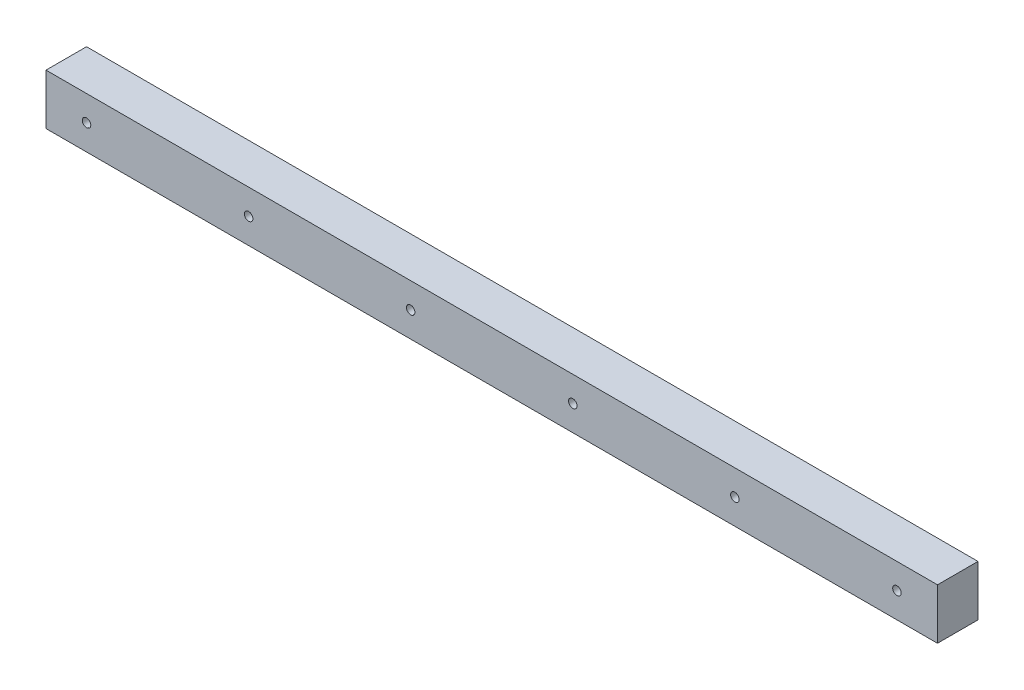
ISO-10303-21;
HEADER;
FILE_DESCRIPTION(('STEP AP214'),'2;1');
FILE_NAME('part.step','',(''),(''),'','','');
FILE_SCHEMA(('AUTOMOTIVE_DESIGN { 1 0 10303 214 1 1 1 1 }'));
ENDSEC;
DATA;
#1=APPLICATION_CONTEXT('core data for automotive mechanical design processes');
#2=APPLICATION_PROTOCOL_DEFINITION('international standard','automotive_design',2000,#1);
#3=PRODUCT_CONTEXT('',#1,'mechanical');
#4=PRODUCT('Part','Part','',(#3));
#5=PRODUCT_RELATED_PRODUCT_CATEGORY('part','',(#4));
#6=PRODUCT_DEFINITION_FORMATION('','',#4);
#7=PRODUCT_DEFINITION_CONTEXT('part definition',#1,'design');
#8=PRODUCT_DEFINITION('design','',#6,#7);
#9=PRODUCT_DEFINITION_SHAPE('','',#8);
#10=(LENGTH_UNIT() NAMED_UNIT(*) SI_UNIT(.MILLI.,.METRE.));
#11=(NAMED_UNIT(*) PLANE_ANGLE_UNIT() SI_UNIT($,.RADIAN.));
#12=(NAMED_UNIT(*) SI_UNIT($,.STERADIAN.) SOLID_ANGLE_UNIT());
#13=UNCERTAINTY_MEASURE_WITH_UNIT(LENGTH_MEASURE(1.E-05),#10,'distance_accuracy_value','');
#14=(GEOMETRIC_REPRESENTATION_CONTEXT(3) GLOBAL_UNCERTAINTY_ASSIGNED_CONTEXT((#13)) GLOBAL_UNIT_ASSIGNED_CONTEXT((#10,
#11,#12)) REPRESENTATION_CONTEXT('',''));
#15=CARTESIAN_POINT('',(0.,0.,0.));
#16=DIRECTION('',(0.,0.,1.));
#17=DIRECTION('',(1.,0.,0.));
#18=AXIS2_PLACEMENT_3D('',#15,#16,#17);
#19=CARTESIAN_POINT('',(220.,25.,-10.));
#20=DIRECTION('',(-1.,0.,0.));
#21=DIRECTION('',(0.,0.,1.));
#22=AXIS2_PLACEMENT_3D('',#19,#20,#21);
#23=PLANE('',#22);
#24=DIRECTION('',(0.,0.,-1.));
#25=VECTOR('',#24,1.);
#26=CARTESIAN_POINT('',(220.,0.,-10.));
#27=LINE('',#26,#25);
#28=CARTESIAN_POINT('',(220.,0.,10.));
#29=VERTEX_POINT('',#28);
#30=CARTESIAN_POINT('',(220.,0.,-10.));
#31=VERTEX_POINT('',#30);
#32=EDGE_CURVE('E215',#29,#31,#27,.T.);
#33=ORIENTED_EDGE('',*,*,#32,.T.);
#34=DIRECTION('',(0.,-1.,0.));
#35=VECTOR('',#34,1.);
#36=CARTESIAN_POINT('',(220.,25.,-10.));
#37=LINE('',#36,#35);
#38=CARTESIAN_POINT('',(220.,25.,-10.));
#39=VERTEX_POINT('',#38);
#40=EDGE_CURVE('E11',#39,#31,#37,.T.);
#41=ORIENTED_EDGE('',*,*,#40,.F.);
#42=DIRECTION('',(0.,0.,-1.));
#43=VECTOR('',#42,1.);
#44=CARTESIAN_POINT('',(220.,25.,-10.));
#45=LINE('',#44,#43);
#46=CARTESIAN_POINT('',(220.,25.,10.));
#47=VERTEX_POINT('',#46);
#48=EDGE_CURVE('E216',#47,#39,#45,.T.);
#49=ORIENTED_EDGE('',*,*,#48,.F.);
#50=DIRECTION('',(0.,-1.,0.));
#51=VECTOR('',#50,1.);
#52=CARTESIAN_POINT('',(220.,25.,10.));
#53=LINE('',#52,#51);
#54=EDGE_CURVE('E226',#47,#29,#53,.T.);
#55=ORIENTED_EDGE('',*,*,#54,.T.);
#56=EDGE_LOOP('',(#33,#41,#49,#55));
#57=FACE_BOUND('',#56,.T.);
#58=ADVANCED_FACE('F42',(#57),#23,.F.);
#59=CARTESIAN_POINT('',(-220.,25.,-10.));
#60=DIRECTION('',(0.,0.,1.));
#61=DIRECTION('',(1.,0.,0.));
#62=AXIS2_PLACEMENT_3D('',#59,#60,#61);
#63=PLANE('',#62);
#64=CARTESIAN_POINT('',(0.,12.5,-10.));
#65=DIRECTION('',(0.,0.,-1.));
#66=DIRECTION('',(-1.,0.,0.));
#67=AXIS2_PLACEMENT_3D('',#64,#65,#66);
#68=CIRCLE('',#67,2.09999999999999);
#69=CARTESIAN_POINT('',(-2.09999999999999,12.5,-10.));
#70=VERTEX_POINT('',#69);
#71=EDGE_CURVE('E167',#70,#70,#68,.T.);
#72=ORIENTED_EDGE('',*,*,#71,.F.);
#73=EDGE_LOOP('',(#72));
#74=FACE_BOUND('',#73,.T.);
#75=CARTESIAN_POINT('',(-60.,12.5,-10.));
#76=DIRECTION('',(0.,0.,-1.));
#77=DIRECTION('',(-1.,0.,0.));
#78=AXIS2_PLACEMENT_3D('',#75,#76,#77);
#79=CIRCLE('',#78,2.09999999999999);
#80=CARTESIAN_POINT('',(-62.1,12.5,-10.));
#81=VERTEX_POINT('',#80);
#82=EDGE_CURVE('E175',#81,#81,#79,.T.);
#83=ORIENTED_EDGE('',*,*,#82,.F.);
#84=EDGE_LOOP('',(#83));
#85=FACE_BOUND('',#84,.T.);
#86=CARTESIAN_POINT('',(-120.,12.5,-10.));
#87=DIRECTION('',(0.,0.,-1.));
#88=DIRECTION('',(-1.,0.,0.));
#89=AXIS2_PLACEMENT_3D('',#86,#87,#88);
#90=CIRCLE('',#89,2.09999999999999);
#91=CARTESIAN_POINT('',(-122.1,12.5,-10.));
#92=VERTEX_POINT('',#91);
#93=EDGE_CURVE('E183',#92,#92,#90,.T.);
#94=ORIENTED_EDGE('',*,*,#93,.F.);
#95=EDGE_LOOP('',(#94));
#96=FACE_BOUND('',#95,.T.);
#97=CARTESIAN_POINT('',(-180.,12.5,-10.));
#98=DIRECTION('',(0.,0.,-1.));
#99=DIRECTION('',(-1.,0.,0.));
#100=AXIS2_PLACEMENT_3D('',#97,#98,#99);
#101=CIRCLE('',#100,2.09999999999999);
#102=CARTESIAN_POINT('',(-182.1,12.5,-10.));
#103=VERTEX_POINT('',#102);
#104=EDGE_CURVE('E187',#103,#103,#101,.T.);
#105=ORIENTED_EDGE('',*,*,#104,.F.);
#106=EDGE_LOOP('',(#105));
#107=FACE_BOUND('',#106,.T.);
#108=CARTESIAN_POINT('',(60.,12.4999999999996,-10.));
#109=DIRECTION('',(0.,0.,-1.));
#110=DIRECTION('',(-1.,0.,0.));
#111=AXIS2_PLACEMENT_3D('',#108,#109,#110);
#112=CIRCLE('',#111,2.09999999999999);
#113=CARTESIAN_POINT('',(57.9,12.4999999999996,-10.));
#114=VERTEX_POINT('',#113);
#115=EDGE_CURVE('E195',#114,#114,#112,.T.);
#116=ORIENTED_EDGE('',*,*,#115,.F.);
#117=EDGE_LOOP('',(#116));
#118=FACE_BOUND('',#117,.T.);
#119=CARTESIAN_POINT('',(120.,12.4999999999992,-10.));
#120=DIRECTION('',(0.,0.,-1.));
#121=DIRECTION('',(-1.,0.,0.));
#122=AXIS2_PLACEMENT_3D('',#119,#120,#121);
#123=CIRCLE('',#122,2.09999999999999);
#124=CARTESIAN_POINT('',(117.9,12.4999999999992,-10.));
#125=VERTEX_POINT('',#124);
#126=EDGE_CURVE('E203',#125,#125,#123,.T.);
#127=ORIENTED_EDGE('',*,*,#126,.F.);
#128=EDGE_LOOP('',(#127));
#129=FACE_BOUND('',#128,.T.);
#130=CARTESIAN_POINT('',(180.,12.4999999999987,-10.));
#131=DIRECTION('',(0.,0.,-1.));
#132=DIRECTION('',(-1.,0.,0.));
#133=AXIS2_PLACEMENT_3D('',#130,#131,#132);
#134=CIRCLE('',#133,2.09999999999999);
#135=CARTESIAN_POINT('',(177.9,12.4999999999987,-10.));
#136=VERTEX_POINT('',#135);
#137=EDGE_CURVE('E207',#136,#136,#134,.T.);
#138=ORIENTED_EDGE('',*,*,#137,.F.);
#139=EDGE_LOOP('',(#138));
#140=FACE_BOUND('',#139,.T.);
#141=DIRECTION('',(-1.,0.,0.));
#142=VECTOR('',#141,1.);
#143=CARTESIAN_POINT('',(-220.,0.,-10.));
#144=LINE('',#143,#142);
#145=CARTESIAN_POINT('',(-220.,0.,-10.));
#146=VERTEX_POINT('',#145);
#147=EDGE_CURVE('E230',#31,#146,#144,.T.);
#148=ORIENTED_EDGE('',*,*,#147,.T.);
#149=DIRECTION('',(0.,-1.,0.));
#150=VECTOR('',#149,1.);
#151=CARTESIAN_POINT('',(-220.,25.,-10.));
#152=LINE('',#151,#150);
#153=CARTESIAN_POINT('',(-220.,25.,-10.));
#154=VERTEX_POINT('',#153);
#155=EDGE_CURVE('E51',#154,#146,#152,.T.);
#156=ORIENTED_EDGE('',*,*,#155,.F.);
#157=DIRECTION('',(-1.,0.,0.));
#158=VECTOR('',#157,1.);
#159=CARTESIAN_POINT('',(-220.,25.,-10.));
#160=LINE('',#159,#158);
#161=EDGE_CURVE('E90',#39,#154,#160,.T.);
#162=ORIENTED_EDGE('',*,*,#161,.F.);
#163=ORIENTED_EDGE('',*,*,#40,.T.);
#164=EDGE_LOOP('',(#148,#156,#162,#163));
#165=FACE_BOUND('',#164,.T.);
#166=ADVANCED_FACE('F261',(#74,#85,#96,#107,#118,#129,#140,#165),#63,.F.);
#167=CARTESIAN_POINT('',(-220.,25.,-10.));
#168=DIRECTION('',(1.,0.,0.));
#169=DIRECTION('',(0.,0.,-1.));
#170=AXIS2_PLACEMENT_3D('',#167,#168,#169);
#171=PLANE('',#170);
#172=DIRECTION('',(0.,0.,1.));
#173=VECTOR('',#172,1.);
#174=CARTESIAN_POINT('',(-220.,0.,-10.));
#175=LINE('',#174,#173);
#176=CARTESIAN_POINT('',(-220.,0.,10.));
#177=VERTEX_POINT('',#176);
#178=EDGE_CURVE('E77',#146,#177,#175,.T.);
#179=ORIENTED_EDGE('',*,*,#178,.T.);
#180=DIRECTION('',(0.,-1.,0.));
#181=VECTOR('',#180,1.);
#182=CARTESIAN_POINT('',(-220.,25.,10.));
#183=LINE('',#182,#181);
#184=CARTESIAN_POINT('',(-220.,25.,10.));
#185=VERTEX_POINT('',#184);
#186=EDGE_CURVE('E239',#185,#177,#183,.T.);
#187=ORIENTED_EDGE('',*,*,#186,.F.);
#188=DIRECTION('',(0.,0.,1.));
#189=VECTOR('',#188,1.);
#190=CARTESIAN_POINT('',(-220.,25.,-10.));
#191=LINE('',#190,#189);
#192=EDGE_CURVE('E221',#154,#185,#191,.T.);
#193=ORIENTED_EDGE('',*,*,#192,.F.);
#194=ORIENTED_EDGE('',*,*,#155,.T.);
#195=EDGE_LOOP('',(#179,#187,#193,#194));
#196=FACE_BOUND('',#195,.T.);
#197=ADVANCED_FACE('F243',(#196),#171,.F.);
#198=CARTESIAN_POINT('',(-220.,25.,10.));
#199=DIRECTION('',(0.,0.,-1.));
#200=DIRECTION('',(-1.,0.,0.));
#201=AXIS2_PLACEMENT_3D('',#198,#199,#200);
#202=PLANE('',#201);
#203=CARTESIAN_POINT('',(40.,12.5,10.));
#204=DIRECTION('',(0.,0.,1.));
#205=DIRECTION('',(1.,0.,0.));
#206=AXIS2_PLACEMENT_3D('',#203,#204,#205);
#207=CIRCLE('',#206,2.09999999999999);
#208=CARTESIAN_POINT('',(42.1,12.5,10.));
#209=VERTEX_POINT('',#208);
#210=EDGE_CURVE('E130',#209,#209,#207,.T.);
#211=ORIENTED_EDGE('',*,*,#210,.F.);
#212=EDGE_LOOP('',(#211));
#213=FACE_BOUND('',#212,.T.);
#214=CARTESIAN_POINT('',(120.,12.5,10.));
#215=DIRECTION('',(0.,0.,1.));
#216=DIRECTION('',(1.,0.,0.));
#217=AXIS2_PLACEMENT_3D('',#214,#215,#216);
#218=CIRCLE('',#217,2.09999999999999);
#219=CARTESIAN_POINT('',(122.1,12.5,10.));
#220=VERTEX_POINT('',#219);
#221=EDGE_CURVE('E129',#220,#220,#218,.T.);
#222=ORIENTED_EDGE('',*,*,#221,.F.);
#223=EDGE_LOOP('',(#222));
#224=FACE_BOUND('',#223,.T.);
#225=CARTESIAN_POINT('',(200.,12.5,10.));
#226=DIRECTION('',(0.,0.,1.));
#227=DIRECTION('',(1.,0.,0.));
#228=AXIS2_PLACEMENT_3D('',#225,#226,#227);
#229=CIRCLE('',#228,2.09999999999999);
#230=CARTESIAN_POINT('',(202.1,12.5,10.));
#231=VERTEX_POINT('',#230);
#232=EDGE_CURVE('E135',#231,#231,#229,.T.);
#233=ORIENTED_EDGE('',*,*,#232,.F.);
#234=EDGE_LOOP('',(#233));
#235=FACE_BOUND('',#234,.T.);
#236=CARTESIAN_POINT('',(-40.,12.4999999999994,10.));
#237=DIRECTION('',(0.,0.,1.));
#238=DIRECTION('',(1.,0.,0.));
#239=AXIS2_PLACEMENT_3D('',#236,#237,#238);
#240=CIRCLE('',#239,2.09999999999999);
#241=CARTESIAN_POINT('',(-37.9,12.4999999999994,10.));
#242=VERTEX_POINT('',#241);
#243=EDGE_CURVE('E147',#242,#242,#240,.T.);
#244=ORIENTED_EDGE('',*,*,#243,.F.);
#245=EDGE_LOOP('',(#244));
#246=FACE_BOUND('',#245,.T.);
#247=CARTESIAN_POINT('',(-120.,12.4999999999989,10.));
#248=DIRECTION('',(0.,0.,1.));
#249=DIRECTION('',(1.,0.,0.));
#250=AXIS2_PLACEMENT_3D('',#247,#248,#249);
#251=CIRCLE('',#250,2.09999999999999);
#252=CARTESIAN_POINT('',(-117.9,12.4999999999989,10.));
#253=VERTEX_POINT('',#252);
#254=EDGE_CURVE('E155',#253,#253,#251,.T.);
#255=ORIENTED_EDGE('',*,*,#254,.F.);
#256=EDGE_LOOP('',(#255));
#257=FACE_BOUND('',#256,.T.);
#258=CARTESIAN_POINT('',(-200.,12.4999999999983,10.));
#259=DIRECTION('',(0.,0.,1.));
#260=DIRECTION('',(1.,0.,0.));
#261=AXIS2_PLACEMENT_3D('',#258,#259,#260);
#262=CIRCLE('',#261,2.09999999999999);
#263=CARTESIAN_POINT('',(-197.9,12.4999999999983,10.));
#264=VERTEX_POINT('',#263);
#265=EDGE_CURVE('E159',#264,#264,#262,.T.);
#266=ORIENTED_EDGE('',*,*,#265,.F.);
#267=EDGE_LOOP('',(#266));
#268=FACE_BOUND('',#267,.T.);
#269=DIRECTION('',(1.,0.,0.));
#270=VECTOR('',#269,1.);
#271=CARTESIAN_POINT('',(-220.,0.,10.));
#272=LINE('',#271,#270);
#273=EDGE_CURVE('E83',#177,#29,#272,.T.);
#274=ORIENTED_EDGE('',*,*,#273,.T.);
#275=ORIENTED_EDGE('',*,*,#54,.F.);
#276=DIRECTION('',(1.,0.,0.));
#277=VECTOR('',#276,1.);
#278=CARTESIAN_POINT('',(-220.,25.,10.));
#279=LINE('',#278,#277);
#280=EDGE_CURVE('E59',#185,#47,#279,.T.);
#281=ORIENTED_EDGE('',*,*,#280,.F.);
#282=ORIENTED_EDGE('',*,*,#186,.T.);
#283=EDGE_LOOP('',(#274,#275,#281,#282));
#284=FACE_BOUND('',#283,.T.);
#285=ADVANCED_FACE('F250',(#213,#224,#235,#246,#257,#268,#284),#202,.F.);
#286=CARTESIAN_POINT('',(0.,25.,0.));
#287=DIRECTION('',(0.,1.,0.));
#288=DIRECTION('',(0.,0.,1.));
#289=AXIS2_PLACEMENT_3D('',#286,#287,#288);
#290=PLANE('',#289);
#291=ORIENTED_EDGE('',*,*,#48,.T.);
#292=ORIENTED_EDGE('',*,*,#161,.T.);
#293=ORIENTED_EDGE('',*,*,#192,.T.);
#294=ORIENTED_EDGE('',*,*,#280,.T.);
#295=EDGE_LOOP('',(#291,#292,#293,#294));
#296=FACE_BOUND('',#295,.T.);
#297=ADVANCED_FACE('F252',(#296),#290,.T.);
#298=CARTESIAN_POINT('',(0.,0.,0.));
#299=DIRECTION('',(0.,1.,0.));
#300=DIRECTION('',(0.,0.,1.));
#301=AXIS2_PLACEMENT_3D('',#298,#299,#300);
#302=PLANE('',#301);
#303=ORIENTED_EDGE('',*,*,#32,.F.);
#304=ORIENTED_EDGE('',*,*,#273,.F.);
#305=ORIENTED_EDGE('',*,*,#178,.F.);
#306=ORIENTED_EDGE('',*,*,#147,.F.);
#307=EDGE_LOOP('',(#303,#304,#305,#306));
#308=FACE_BOUND('',#307,.T.);
#309=ADVANCED_FACE('F246',(#308),#302,.F.);
#310=CARTESIAN_POINT('',(180.,12.4999999999987,5.));
#311=DIRECTION('',(0.,0.,-1.));
#312=DIRECTION('',(-1.,0.,0.));
#313=AXIS2_PLACEMENT_3D('',#310,#311,#312);
#314=CONICAL_SURFACE('',#313,2.09999999999999,1.02974425867665);
#315=CARTESIAN_POINT('',(180.,12.4999999999987,6.26180729995787));
#316=VERTEX_POINT('',#315);
#317=VERTEX_LOOP('',#316);
#318=FACE_BOUND('',#317,.T.);
#319=CARTESIAN_POINT('',(180.,12.4999999999987,5.));
#320=DIRECTION('',(0.,0.,-1.));
#321=DIRECTION('',(-1.,0.,0.));
#322=AXIS2_PLACEMENT_3D('',#319,#320,#321);
#323=CIRCLE('',#322,2.09999999999999);
#324=CARTESIAN_POINT('',(177.9,12.4999999999987,5.));
#325=VERTEX_POINT('',#324);
#326=EDGE_CURVE('E211',#325,#325,#323,.T.);
#327=ORIENTED_EDGE('',*,*,#326,.T.);
#328=EDGE_LOOP('',(#327));
#329=FACE_BOUND('',#328,.T.);
#330=ADVANCED_FACE('F290',(#318,#329),#314,.F.);
#331=CARTESIAN_POINT('',(180.,12.4999999999987,-10.));
#332=DIRECTION('',(0.,0.,-1.));
#333=DIRECTION('',(-1.,0.,0.));
#334=AXIS2_PLACEMENT_3D('',#331,#332,#333);
#335=CYLINDRICAL_SURFACE('',#334,2.09999999999999);
#336=ORIENTED_EDGE('',*,*,#326,.F.);
#337=EDGE_LOOP('',(#336));
#338=FACE_BOUND('',#337,.T.);
#339=ORIENTED_EDGE('',*,*,#137,.T.);
#340=EDGE_LOOP('',(#339));
#341=FACE_BOUND('',#340,.T.);
#342=ADVANCED_FACE('F287',(#338,#341),#335,.F.);
#343=CARTESIAN_POINT('',(120.,12.4999999999992,-10.));
#344=DIRECTION('',(0.,0.,-1.));
#345=DIRECTION('',(-1.,0.,0.));
#346=AXIS2_PLACEMENT_3D('',#343,#344,#345);
#347=CYLINDRICAL_SURFACE('',#346,2.09999999999999);
#348=ORIENTED_EDGE('',*,*,#126,.T.);
#349=EDGE_LOOP('',(#348));
#350=FACE_BOUND('',#349,.T.);
#351=ORIENTED_EDGE('',*,*,#221,.T.);
#352=EDGE_LOOP('',(#351));
#353=FACE_BOUND('',#352,.T.);
#354=ADVANCED_FACE('F289',(#350,#353),#347,.F.);
#355=CARTESIAN_POINT('',(60.,12.4999999999996,5.));
#356=DIRECTION('',(0.,0.,-1.));
#357=DIRECTION('',(-1.,0.,0.));
#358=AXIS2_PLACEMENT_3D('',#355,#356,#357);
#359=CONICAL_SURFACE('',#358,2.1,1.02974425867665);
#360=CARTESIAN_POINT('',(60.,12.4999999999996,6.26180729995787));
#361=VERTEX_POINT('',#360);
#362=VERTEX_LOOP('',#361);
#363=FACE_BOUND('',#362,.T.);
#364=CARTESIAN_POINT('',(60.,12.4999999999996,5.));
#365=DIRECTION('',(0.,0.,-1.));
#366=DIRECTION('',(-1.,0.,0.));
#367=AXIS2_PLACEMENT_3D('',#364,#365,#366);
#368=CIRCLE('',#367,2.1);
#369=CARTESIAN_POINT('',(57.9,12.4999999999996,5.));
#370=VERTEX_POINT('',#369);
#371=EDGE_CURVE('E199',#370,#370,#368,.T.);
#372=ORIENTED_EDGE('',*,*,#371,.T.);
#373=EDGE_LOOP('',(#372));
#374=FACE_BOUND('',#373,.T.);
#375=ADVANCED_FACE('F298',(#363,#374),#359,.F.);
#376=CARTESIAN_POINT('',(60.,12.4999999999996,-10.));
#377=DIRECTION('',(0.,0.,-1.));
#378=DIRECTION('',(-1.,0.,0.));
#379=AXIS2_PLACEMENT_3D('',#376,#377,#378);
#380=CYLINDRICAL_SURFACE('',#379,2.09999999999999);
#381=ORIENTED_EDGE('',*,*,#371,.F.);
#382=EDGE_LOOP('',(#381));
#383=FACE_BOUND('',#382,.T.);
#384=ORIENTED_EDGE('',*,*,#115,.T.);
#385=EDGE_LOOP('',(#384));
#386=FACE_BOUND('',#385,.T.);
#387=ADVANCED_FACE('F330',(#383,#386),#380,.F.);
#388=CARTESIAN_POINT('',(-180.,12.5,5.));
#389=DIRECTION('',(0.,0.,-1.));
#390=DIRECTION('',(-1.,0.,0.));
#391=AXIS2_PLACEMENT_3D('',#388,#389,#390);
#392=CONICAL_SURFACE('',#391,2.09999999999999,1.02974425867665);
#393=CARTESIAN_POINT('',(-180.,12.5,6.26180729995787));
#394=VERTEX_POINT('',#393);
#395=VERTEX_LOOP('',#394);
#396=FACE_BOUND('',#395,.T.);
#397=CARTESIAN_POINT('',(-180.,12.5,5.));
#398=DIRECTION('',(0.,0.,-1.));
#399=DIRECTION('',(-1.,0.,0.));
#400=AXIS2_PLACEMENT_3D('',#397,#398,#399);
#401=CIRCLE('',#400,2.09999999999999);
#402=CARTESIAN_POINT('',(-182.1,12.5,5.));
#403=VERTEX_POINT('',#402);
#404=EDGE_CURVE('E191',#403,#403,#401,.T.);
#405=ORIENTED_EDGE('',*,*,#404,.T.);
#406=EDGE_LOOP('',(#405));
#407=FACE_BOUND('',#406,.T.);
#408=ADVANCED_FACE('F337',(#396,#407),#392,.F.);
#409=CARTESIAN_POINT('',(-180.,12.5,-10.));
#410=DIRECTION('',(0.,0.,-1.));
#411=DIRECTION('',(-1.,0.,0.));
#412=AXIS2_PLACEMENT_3D('',#409,#410,#411);
#413=CYLINDRICAL_SURFACE('',#412,2.09999999999999);
#414=ORIENTED_EDGE('',*,*,#404,.F.);
#415=EDGE_LOOP('',(#414));
#416=FACE_BOUND('',#415,.T.);
#417=ORIENTED_EDGE('',*,*,#104,.T.);
#418=EDGE_LOOP('',(#417));
#419=FACE_BOUND('',#418,.T.);
#420=ADVANCED_FACE('F348',(#416,#419),#413,.F.);
#421=CARTESIAN_POINT('',(-120.,12.5,-10.));
#422=DIRECTION('',(0.,0.,-1.));
#423=DIRECTION('',(-1.,0.,0.));
#424=AXIS2_PLACEMENT_3D('',#421,#422,#423);
#425=CYLINDRICAL_SURFACE('',#424,2.09999999999999);
#426=ORIENTED_EDGE('',*,*,#93,.T.);
#427=EDGE_LOOP('',(#426));
#428=FACE_BOUND('',#427,.T.);
#429=ORIENTED_EDGE('',*,*,#254,.T.);
#430=EDGE_LOOP('',(#429));
#431=FACE_BOUND('',#430,.T.);
#432=ADVANCED_FACE('F356',(#428,#431),#425,.F.);
#433=CARTESIAN_POINT('',(-60.,12.5,5.));
#434=DIRECTION('',(0.,0.,-1.));
#435=DIRECTION('',(-1.,0.,0.));
#436=AXIS2_PLACEMENT_3D('',#433,#434,#435);
#437=CONICAL_SURFACE('',#436,2.1,1.02974425867665);
#438=CARTESIAN_POINT('',(-60.,12.5,6.26180729995787));
#439=VERTEX_POINT('',#438);
#440=VERTEX_LOOP('',#439);
#441=FACE_BOUND('',#440,.T.);
#442=CARTESIAN_POINT('',(-60.,12.5,5.));
#443=DIRECTION('',(0.,0.,-1.));
#444=DIRECTION('',(-1.,0.,0.));
#445=AXIS2_PLACEMENT_3D('',#442,#443,#444);
#446=CIRCLE('',#445,2.1);
#447=CARTESIAN_POINT('',(-62.1,12.5,5.));
#448=VERTEX_POINT('',#447);
#449=EDGE_CURVE('E179',#448,#448,#446,.T.);
#450=ORIENTED_EDGE('',*,*,#449,.T.);
#451=EDGE_LOOP('',(#450));
#452=FACE_BOUND('',#451,.T.);
#453=ADVANCED_FACE('F364',(#441,#452),#437,.F.);
#454=CARTESIAN_POINT('',(-60.,12.5,-10.));
#455=DIRECTION('',(0.,0.,-1.));
#456=DIRECTION('',(-1.,0.,0.));
#457=AXIS2_PLACEMENT_3D('',#454,#455,#456);
#458=CYLINDRICAL_SURFACE('',#457,2.09999999999999);
#459=ORIENTED_EDGE('',*,*,#449,.F.);
#460=EDGE_LOOP('',(#459));
#461=FACE_BOUND('',#460,.T.);
#462=ORIENTED_EDGE('',*,*,#82,.T.);
#463=EDGE_LOOP('',(#462));
#464=FACE_BOUND('',#463,.T.);
#465=ADVANCED_FACE('F368',(#461,#464),#458,.F.);
#466=CARTESIAN_POINT('',(0.,12.5,5.));
#467=DIRECTION('',(0.,0.,-1.));
#468=DIRECTION('',(-1.,0.,0.));
#469=AXIS2_PLACEMENT_3D('',#466,#467,#468);
#470=CONICAL_SURFACE('',#469,2.1,1.02974425867665);
#471=CARTESIAN_POINT('',(0.,12.5,6.26180729995787));
#472=VERTEX_POINT('',#471);
#473=VERTEX_LOOP('',#472);
#474=FACE_BOUND('',#473,.T.);
#475=CARTESIAN_POINT('',(0.,12.5,5.));
#476=DIRECTION('',(0.,0.,-1.));
#477=DIRECTION('',(-1.,0.,0.));
#478=AXIS2_PLACEMENT_3D('',#475,#476,#477);
#479=CIRCLE('',#478,2.1);
#480=CARTESIAN_POINT('',(-2.1,12.5,5.));
#481=VERTEX_POINT('',#480);
#482=EDGE_CURVE('E171',#481,#481,#479,.T.);
#483=ORIENTED_EDGE('',*,*,#482,.T.);
#484=EDGE_LOOP('',(#483));
#485=FACE_BOUND('',#484,.T.);
#486=ADVANCED_FACE('F376',(#474,#485),#470,.F.);
#487=CARTESIAN_POINT('',(0.,12.5,-10.));
#488=DIRECTION('',(0.,0.,-1.));
#489=DIRECTION('',(-1.,0.,0.));
#490=AXIS2_PLACEMENT_3D('',#487,#488,#489);
#491=CYLINDRICAL_SURFACE('',#490,2.09999999999999);
#492=ORIENTED_EDGE('',*,*,#482,.F.);
#493=EDGE_LOOP('',(#492));
#494=FACE_BOUND('',#493,.T.);
#495=ORIENTED_EDGE('',*,*,#71,.T.);
#496=EDGE_LOOP('',(#495));
#497=FACE_BOUND('',#496,.T.);
#498=ADVANCED_FACE('F387',(#494,#497),#491,.F.);
#499=CARTESIAN_POINT('',(-200.,12.4999999999983,-5.));
#500=DIRECTION('',(0.,0.,1.));
#501=DIRECTION('',(1.,0.,0.));
#502=AXIS2_PLACEMENT_3D('',#499,#500,#501);
#503=CONICAL_SURFACE('',#502,2.09999999999999,1.02974425867665);
#504=CARTESIAN_POINT('',(-200.,12.4999999999983,-6.26180729995787));
#505=VERTEX_POINT('',#504);
#506=VERTEX_LOOP('',#505);
#507=FACE_BOUND('',#506,.T.);
#508=CARTESIAN_POINT('',(-200.,12.4999999999983,-5.));
#509=DIRECTION('',(0.,0.,1.));
#510=DIRECTION('',(1.,0.,0.));
#511=AXIS2_PLACEMENT_3D('',#508,#509,#510);
#512=CIRCLE('',#511,2.09999999999999);
#513=CARTESIAN_POINT('',(-197.9,12.4999999999983,-5.));
#514=VERTEX_POINT('',#513);
#515=EDGE_CURVE('E163',#514,#514,#512,.T.);
#516=ORIENTED_EDGE('',*,*,#515,.T.);
#517=EDGE_LOOP('',(#516));
#518=FACE_BOUND('',#517,.T.);
#519=ADVANCED_FACE('F394',(#507,#518),#503,.F.);
#520=CARTESIAN_POINT('',(-200.,12.4999999999983,10.));
#521=DIRECTION('',(0.,0.,1.));
#522=DIRECTION('',(1.,0.,0.));
#523=AXIS2_PLACEMENT_3D('',#520,#521,#522);
#524=CYLINDRICAL_SURFACE('',#523,2.09999999999999);
#525=ORIENTED_EDGE('',*,*,#515,.F.);
#526=EDGE_LOOP('',(#525));
#527=FACE_BOUND('',#526,.T.);
#528=ORIENTED_EDGE('',*,*,#265,.T.);
#529=EDGE_LOOP('',(#528));
#530=FACE_BOUND('',#529,.T.);
#531=ADVANCED_FACE('F415',(#527,#530),#524,.F.);
#532=CARTESIAN_POINT('',(-40.,12.4999999999994,-5.));
#533=DIRECTION('',(0.,0.,1.));
#534=DIRECTION('',(1.,0.,0.));
#535=AXIS2_PLACEMENT_3D('',#532,#533,#534);
#536=CONICAL_SURFACE('',#535,2.1,1.02974425867665);
#537=CARTESIAN_POINT('',(-40.,12.4999999999994,-6.26180729995787));
#538=VERTEX_POINT('',#537);
#539=VERTEX_LOOP('',#538);
#540=FACE_BOUND('',#539,.T.);
#541=CARTESIAN_POINT('',(-40.,12.4999999999994,-5.));
#542=DIRECTION('',(0.,0.,1.));
#543=DIRECTION('',(1.,0.,0.));
#544=AXIS2_PLACEMENT_3D('',#541,#542,#543);
#545=CIRCLE('',#544,2.1);
#546=CARTESIAN_POINT('',(-37.9,12.4999999999994,-5.));
#547=VERTEX_POINT('',#546);
#548=EDGE_CURVE('E151',#547,#547,#545,.T.);
#549=ORIENTED_EDGE('',*,*,#548,.T.);
#550=EDGE_LOOP('',(#549));
#551=FACE_BOUND('',#550,.T.);
#552=ADVANCED_FACE('F424',(#540,#551),#536,.F.);
#553=CARTESIAN_POINT('',(-40.,12.4999999999994,10.));
#554=DIRECTION('',(0.,0.,1.));
#555=DIRECTION('',(1.,0.,0.));
#556=AXIS2_PLACEMENT_3D('',#553,#554,#555);
#557=CYLINDRICAL_SURFACE('',#556,2.09999999999999);
#558=ORIENTED_EDGE('',*,*,#548,.F.);
#559=EDGE_LOOP('',(#558));
#560=FACE_BOUND('',#559,.T.);
#561=ORIENTED_EDGE('',*,*,#243,.T.);
#562=EDGE_LOOP('',(#561));
#563=FACE_BOUND('',#562,.T.);
#564=ADVANCED_FACE('F433',(#560,#563),#557,.F.);
#565=CARTESIAN_POINT('',(200.,12.5,-5.));
#566=DIRECTION('',(0.,0.,1.));
#567=DIRECTION('',(1.,0.,0.));
#568=AXIS2_PLACEMENT_3D('',#565,#566,#567);
#569=CONICAL_SURFACE('',#568,2.09999999999999,1.02974425867665);
#570=CARTESIAN_POINT('',(200.,12.5,-6.26180729995787));
#571=VERTEX_POINT('',#570);
#572=VERTEX_LOOP('',#571);
#573=FACE_BOUND('',#572,.T.);
#574=CARTESIAN_POINT('',(200.,12.5,-5.));
#575=DIRECTION('',(0.,0.,1.));
#576=DIRECTION('',(1.,0.,0.));
#577=AXIS2_PLACEMENT_3D('',#574,#575,#576);
#578=CIRCLE('',#577,2.09999999999999);
#579=CARTESIAN_POINT('',(202.1,12.5,-5.));
#580=VERTEX_POINT('',#579);
#581=EDGE_CURVE('E143',#580,#580,#578,.T.);
#582=ORIENTED_EDGE('',*,*,#581,.T.);
#583=EDGE_LOOP('',(#582));
#584=FACE_BOUND('',#583,.T.);
#585=ADVANCED_FACE('F441',(#573,#584),#569,.F.);
#586=CARTESIAN_POINT('',(200.,12.5,10.));
#587=DIRECTION('',(0.,0.,1.));
#588=DIRECTION('',(1.,0.,0.));
#589=AXIS2_PLACEMENT_3D('',#586,#587,#588);
#590=CYLINDRICAL_SURFACE('',#589,2.09999999999999);
#591=ORIENTED_EDGE('',*,*,#581,.F.);
#592=EDGE_LOOP('',(#591));
#593=FACE_BOUND('',#592,.T.);
#594=ORIENTED_EDGE('',*,*,#232,.T.);
#595=EDGE_LOOP('',(#594));
#596=FACE_BOUND('',#595,.T.);
#597=ADVANCED_FACE('F122',(#593,#596),#590,.F.);
#598=CARTESIAN_POINT('',(40.,12.5,-5.));
#599=DIRECTION('',(0.,0.,1.));
#600=DIRECTION('',(1.,0.,0.));
#601=AXIS2_PLACEMENT_3D('',#598,#599,#600);
#602=CONICAL_SURFACE('',#601,2.1,1.02974425867665);
#603=CARTESIAN_POINT('',(40.,12.5,-6.26180729995787));
#604=VERTEX_POINT('',#603);
#605=VERTEX_LOOP('',#604);
#606=FACE_BOUND('',#605,.T.);
#607=CARTESIAN_POINT('',(40.,12.5,-5.));
#608=DIRECTION('',(0.,0.,1.));
#609=DIRECTION('',(1.,0.,0.));
#610=AXIS2_PLACEMENT_3D('',#607,#608,#609);
#611=CIRCLE('',#610,2.1);
#612=CARTESIAN_POINT('',(42.1,12.5,-5.));
#613=VERTEX_POINT('',#612);
#614=EDGE_CURVE('E126',#613,#613,#611,.T.);
#615=ORIENTED_EDGE('',*,*,#614,.T.);
#616=EDGE_LOOP('',(#615));
#617=FACE_BOUND('',#616,.T.);
#618=ADVANCED_FACE('F118',(#606,#617),#602,.F.);
#619=CARTESIAN_POINT('',(40.,12.5,10.));
#620=DIRECTION('',(0.,0.,1.));
#621=DIRECTION('',(1.,0.,0.));
#622=AXIS2_PLACEMENT_3D('',#619,#620,#621);
#623=CYLINDRICAL_SURFACE('',#622,2.09999999999999);
#624=ORIENTED_EDGE('',*,*,#614,.F.);
#625=EDGE_LOOP('',(#624));
#626=FACE_BOUND('',#625,.T.);
#627=ORIENTED_EDGE('',*,*,#210,.T.);
#628=EDGE_LOOP('',(#627));
#629=FACE_BOUND('',#628,.T.);
#630=ADVANCED_FACE('F121',(#626,#629),#623,.F.);
#631=CLOSED_SHELL('',(#58,#166,#197,#285,#297,#309,#330,#342,#354,#375,#387,#408,#420,#432,#453,
#465,#486,#498,#519,#531,#552,#564,#585,#597,#618,#630));
#632=MANIFOLD_SOLID_BREP('B2',#631);
#633=ADVANCED_BREP_SHAPE_REPRESENTATION('',(#18,#632),#14);
#634=SHAPE_DEFINITION_REPRESENTATION(#9,#633);
ENDSEC;
END-ISO-10303-21;
